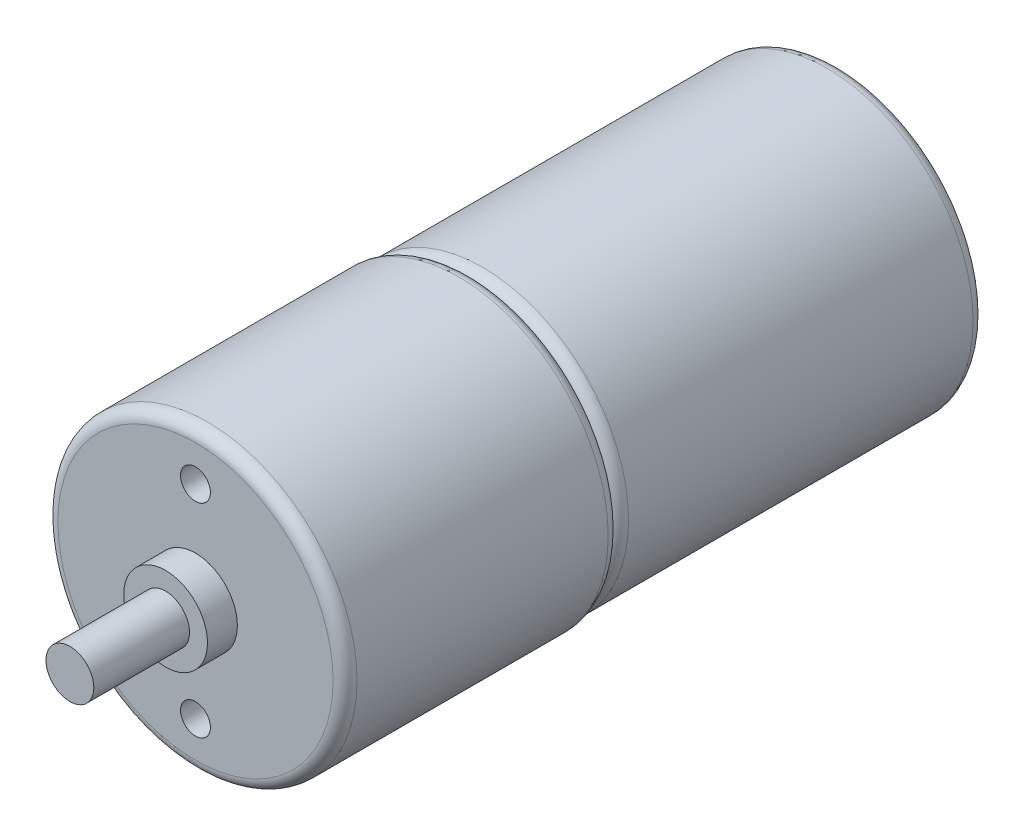
ISO-10303-21;
HEADER;
FILE_DESCRIPTION(('STEP AP214'),'2;1');
FILE_NAME('part.step','',(''),(''),'','','');
FILE_SCHEMA(('AUTOMOTIVE_DESIGN { 1 0 10303 214 1 1 1 1 }'));
ENDSEC;
DATA;
#1=APPLICATION_CONTEXT('core data for automotive mechanical design processes');
#2=APPLICATION_PROTOCOL_DEFINITION('international standard','automotive_design',2000,#1);
#3=PRODUCT_CONTEXT('',#1,'mechanical');
#4=PRODUCT('Part','Part','',(#3));
#5=PRODUCT_RELATED_PRODUCT_CATEGORY('part','',(#4));
#6=PRODUCT_DEFINITION_FORMATION('','',#4);
#7=PRODUCT_DEFINITION_CONTEXT('part definition',#1,'design');
#8=PRODUCT_DEFINITION('design','',#6,#7);
#9=PRODUCT_DEFINITION_SHAPE('','',#8);
#10=(LENGTH_UNIT() NAMED_UNIT(*) SI_UNIT(.MILLI.,.METRE.));
#11=(NAMED_UNIT(*) PLANE_ANGLE_UNIT() SI_UNIT($,.RADIAN.));
#12=(NAMED_UNIT(*) SI_UNIT($,.STERADIAN.) SOLID_ANGLE_UNIT());
#13=UNCERTAINTY_MEASURE_WITH_UNIT(LENGTH_MEASURE(1.E-05),#10,'distance_accuracy_value','');
#14=(GEOMETRIC_REPRESENTATION_CONTEXT(3) GLOBAL_UNCERTAINTY_ASSIGNED_CONTEXT((#13)) GLOBAL_UNIT_ASSIGNED_CONTEXT((#10,
#11,#12)) REPRESENTATION_CONTEXT('',''));
#15=CARTESIAN_POINT('',(0.,0.,0.));
#16=DIRECTION('',(0.,0.,1.));
#17=DIRECTION('',(1.,0.,0.));
#18=AXIS2_PLACEMENT_3D('',#15,#16,#17);
#19=CARTESIAN_POINT('',(-6.47143601205193,0.742894440159164,56.2999999999951));
#20=DIRECTION('',(0.,0.,1.));
#21=DIRECTION('',(1.,0.,0.));
#22=AXIS2_PLACEMENT_3D('',#19,#20,#21);
#23=PLANE('',#22);
#24=CARTESIAN_POINT('',(-6.47143601205193,0.742894440159164,56.2999999999951));
#25=DIRECTION('',(0.,0.,1.));
#26=DIRECTION('',(1.,0.,0.));
#27=AXIS2_PLACEMENT_3D('',#24,#25,#26);
#28=CIRCLE('',#27,3.5);
#29=CARTESIAN_POINT('',(-2.97143601205193,0.742894440159164,56.2999999999951));
#30=VERTEX_POINT('',#29);
#31=EDGE_CURVE('P0_E34',#30,#30,#28,.T.);
#32=ORIENTED_EDGE('',*,*,#31,.T.);
#33=EDGE_LOOP('',(#32));
#34=FACE_BOUND('',#33,.T.);
#35=CARTESIAN_POINT('',(-6.47143601205193,0.742894440159164,56.2999999999951));
#36=DIRECTION('',(0.,0.,1.));
#37=DIRECTION('',(1.,0.,0.));
#38=AXIS2_PLACEMENT_3D('',#35,#36,#37);
#39=CIRCLE('',#38,2.);
#40=CARTESIAN_POINT('',(-4.47143601205193,0.742894440159164,56.2999999999951));
#41=VERTEX_POINT('',#40);
#42=EDGE_CURVE('P0_E41',#41,#41,#39,.T.);
#43=ORIENTED_EDGE('',*,*,#42,.F.);
#44=EDGE_LOOP('',(#43));
#45=FACE_BOUND('',#44,.T.);
#46=ADVANCED_FACE('P0_F14',(#34,#45),#23,.T.);
#47=CARTESIAN_POINT('',(-6.47143601205193,0.742894440159164,53.7999999999951));
#48=DIRECTION('',(0.,0.,1.));
#49=DIRECTION('',(1.,0.,0.));
#50=AXIS2_PLACEMENT_3D('',#47,#48,#49);
#51=PLANE('',#50);
#52=CARTESIAN_POINT('',(-6.47143601205229,-7.75710555984084,53.7999999999951));
#53=DIRECTION('',(0.,0.,1.));
#54=DIRECTION('',(1.,0.,0.));
#55=AXIS2_PLACEMENT_3D('',#52,#53,#54);
#56=CIRCLE('',#55,1.25);
#57=CARTESIAN_POINT('',(-5.22143601205229,-7.75710555984084,53.7999999999951));
#58=VERTEX_POINT('',#57);
#59=EDGE_CURVE('P0_E53',#58,#58,#56,.T.);
#60=ORIENTED_EDGE('',*,*,#59,.F.);
#61=EDGE_LOOP('',(#60));
#62=FACE_BOUND('',#61,.T.);
#63=CARTESIAN_POINT('',(-6.47143601205223,9.24289444015916,53.7999999999951));
#64=DIRECTION('',(0.,0.,1.));
#65=DIRECTION('',(1.,0.,0.));
#66=AXIS2_PLACEMENT_3D('',#63,#64,#65);
#67=CIRCLE('',#66,1.25);
#68=CARTESIAN_POINT('',(-5.22143601205223,9.24289444015916,53.7999999999951));
#69=VERTEX_POINT('',#68);
#70=EDGE_CURVE('P0_E47',#69,#69,#67,.T.);
#71=ORIENTED_EDGE('',*,*,#70,.F.);
#72=EDGE_LOOP('',(#71));
#73=FACE_BOUND('',#72,.T.);
#74=CARTESIAN_POINT('',(-6.47143601205193,0.742894440159164,53.7999999999951));
#75=DIRECTION('',(0.,0.,1.));
#76=DIRECTION('',(1.,0.,0.));
#77=AXIS2_PLACEMENT_3D('',#74,#75,#76);
#78=CIRCLE('',#77,11.5);
#79=CARTESIAN_POINT('',(5.02856398794807,0.742894440159164,53.7999999999951));
#80=VERTEX_POINT('',#79);
#81=EDGE_CURVE('P0_E10',#80,#80,#78,.T.);
#82=ORIENTED_EDGE('',*,*,#81,.T.);
#83=EDGE_LOOP('',(#82));
#84=FACE_BOUND('',#83,.T.);
#85=CARTESIAN_POINT('',(-6.47143601205193,0.742894440159164,53.7999999999951));
#86=DIRECTION('',(0.,0.,1.));
#87=DIRECTION('',(1.,0.,0.));
#88=AXIS2_PLACEMENT_3D('',#85,#86,#87);
#89=CIRCLE('',#88,3.5);
#90=CARTESIAN_POINT('',(-2.97143601205193,0.742894440159164,53.7999999999951));
#91=VERTEX_POINT('',#90);
#92=EDGE_CURVE('P0_E35',#91,#91,#89,.T.);
#93=ORIENTED_EDGE('',*,*,#92,.F.);
#94=EDGE_LOOP('',(#93));
#95=FACE_BOUND('',#94,.T.);
#96=ADVANCED_FACE('P0_F68',(#62,#73,#84,#95),#51,.T.);
#97=CARTESIAN_POINT('',(-6.47143601205193,0.742894440159164,53.7999999999951));
#98=DIRECTION('',(0.,0.,-1.));
#99=DIRECTION('',(-1.,0.,0.));
#100=AXIS2_PLACEMENT_3D('',#97,#98,#99);
#101=CYLINDRICAL_SURFACE('',#100,12.5);
#102=CARTESIAN_POINT('',(-6.47143601205193,0.742894440159164,31.7999999999951));
#103=DIRECTION('',(0.,0.,1.));
#104=DIRECTION('',(1.,0.,0.));
#105=AXIS2_PLACEMENT_3D('',#102,#103,#104);
#106=CIRCLE('',#105,12.5);
#107=CARTESIAN_POINT('',(6.02856398794807,0.742894440159164,31.7999999999951));
#108=VERTEX_POINT('',#107);
#109=EDGE_CURVE('P0_E25',#108,#108,#106,.T.);
#110=ORIENTED_EDGE('',*,*,#109,.T.);
#111=EDGE_LOOP('',(#110));
#112=FACE_BOUND('',#111,.T.);
#113=CARTESIAN_POINT('',(-6.47143601205193,0.742894440159164,52.7999999999951));
#114=DIRECTION('',(0.,0.,1.));
#115=DIRECTION('',(1.,0.,0.));
#116=AXIS2_PLACEMENT_3D('',#113,#114,#115);
#117=CIRCLE('',#116,12.5);
#118=CARTESIAN_POINT('',(6.02856398794807,0.742894440159164,52.7999999999951));
#119=VERTEX_POINT('',#118);
#120=EDGE_CURVE('P0_E29',#119,#119,#117,.F.);
#121=ORIENTED_EDGE('',*,*,#120,.T.);
#122=EDGE_LOOP('',(#121));
#123=FACE_BOUND('',#122,.T.);
#124=ADVANCED_FACE('P0_F71',(#112,#123),#101,.T.);
#125=CARTESIAN_POINT('',(-6.47143601205193,0.742894440159164,30.7999999999951));
#126=DIRECTION('',(0.,0.,1.));
#127=DIRECTION('',(1.,0.,0.));
#128=AXIS2_PLACEMENT_3D('',#125,#126,#127);
#129=PLANE('',#128);
#130=CARTESIAN_POINT('',(-6.47143601205193,0.742894440159164,30.7999999999951));
#131=DIRECTION('',(0.,0.,1.));
#132=DIRECTION('',(1.,0.,0.));
#133=AXIS2_PLACEMENT_3D('',#130,#131,#132);
#134=CIRCLE('',#133,11.5);
#135=CARTESIAN_POINT('',(5.02856398794807,0.742894440159164,30.7999999999951));
#136=VERTEX_POINT('',#135);
#137=EDGE_CURVE('P0_E21',#136,#136,#134,.F.);
#138=ORIENTED_EDGE('',*,*,#137,.T.);
#139=EDGE_LOOP('',(#138));
#140=FACE_BOUND('',#139,.T.);
#141=ADVANCED_FACE('P0_F80',(#140),#129,.F.);
#142=CARTESIAN_POINT('',(-6.47143601205193,0.742894440159164,56.2999999999951));
#143=DIRECTION('',(0.,0.,-1.));
#144=DIRECTION('',(-1.,0.,0.));
#145=AXIS2_PLACEMENT_3D('',#142,#143,#144);
#146=CYLINDRICAL_SURFACE('',#145,3.5);
#147=ORIENTED_EDGE('',*,*,#31,.F.);
#148=EDGE_LOOP('',(#147));
#149=FACE_BOUND('',#148,.T.);
#150=ORIENTED_EDGE('',*,*,#92,.T.);
#151=EDGE_LOOP('',(#150));
#152=FACE_BOUND('',#151,.T.);
#153=ADVANCED_FACE('P0_F77',(#149,#152),#146,.T.);
#154=CARTESIAN_POINT('',(-6.47143601205193,0.742894440159164,31.7999999999951));
#155=DIRECTION('',(0.,0.,1.));
#156=DIRECTION('',(1.,0.,0.));
#157=AXIS2_PLACEMENT_3D('',#154,#155,#156);
#158=TOROIDAL_SURFACE('',#157,11.5,1.);
#159=ORIENTED_EDGE('',*,*,#137,.F.);
#160=EDGE_LOOP('',(#159));
#161=FACE_BOUND('',#160,.T.);
#162=ORIENTED_EDGE('',*,*,#109,.F.);
#163=EDGE_LOOP('',(#162));
#164=FACE_BOUND('',#163,.T.);
#165=ADVANCED_FACE('P0_F79',(#161,#164),#158,.T.);
#166=CARTESIAN_POINT('',(-6.47143601205193,0.742894440159164,52.7999999999951));
#167=DIRECTION('',(0.,0.,1.));
#168=DIRECTION('',(1.,0.,0.));
#169=AXIS2_PLACEMENT_3D('',#166,#167,#168);
#170=TOROIDAL_SURFACE('',#169,11.5,1.);
#171=ORIENTED_EDGE('',*,*,#120,.F.);
#172=EDGE_LOOP('',(#171));
#173=FACE_BOUND('',#172,.T.);
#174=ORIENTED_EDGE('',*,*,#81,.F.);
#175=EDGE_LOOP('',(#174));
#176=FACE_BOUND('',#175,.T.);
#177=ADVANCED_FACE('P0_F16',(#173,#176),#170,.T.);
#178=CARTESIAN_POINT('',(-6.47143601205193,0.742894440159164,64.2999999999951));
#179=DIRECTION('',(0.,0.,-1.));
#180=DIRECTION('',(-1.,0.,0.));
#181=AXIS2_PLACEMENT_3D('',#178,#179,#180);
#182=CYLINDRICAL_SURFACE('',#181,2.);
#183=CARTESIAN_POINT('',(-6.47143601205193,0.742894440159164,64.2999999999951));
#184=DIRECTION('',(0.,0.,1.));
#185=DIRECTION('',(1.,0.,0.));
#186=AXIS2_PLACEMENT_3D('',#183,#184,#185);
#187=CIRCLE('',#186,2.);
#188=CARTESIAN_POINT('',(-4.47143601205193,0.742894440159164,64.2999999999951));
#189=VERTEX_POINT('',#188);
#190=EDGE_CURVE('P0_E38',#189,#189,#187,.T.);
#191=ORIENTED_EDGE('',*,*,#190,.F.);
#192=EDGE_LOOP('',(#191));
#193=FACE_BOUND('',#192,.T.);
#194=ORIENTED_EDGE('',*,*,#42,.T.);
#195=EDGE_LOOP('',(#194));
#196=FACE_BOUND('',#195,.T.);
#197=ADVANCED_FACE('P0_F98',(#193,#196),#182,.T.);
#198=CARTESIAN_POINT('',(-6.47143601205193,0.742894440159164,64.2999999999951));
#199=DIRECTION('',(0.,0.,1.));
#200=DIRECTION('',(1.,0.,0.));
#201=AXIS2_PLACEMENT_3D('',#198,#199,#200);
#202=PLANE('',#201);
#203=ORIENTED_EDGE('',*,*,#190,.T.);
#204=EDGE_LOOP('',(#203));
#205=FACE_BOUND('',#204,.T.);
#206=ADVANCED_FACE('P0_F101',(#205),#202,.T.);
#207=CARTESIAN_POINT('',(-6.47143601205223,9.24289444015916,43.7999999999951));
#208=DIRECTION('',(0.,0.,1.));
#209=DIRECTION('',(1.,0.,0.));
#210=AXIS2_PLACEMENT_3D('',#207,#208,#209);
#211=CYLINDRICAL_SURFACE('',#210,1.25);
#212=CARTESIAN_POINT('',(-6.47143601205223,9.24289444015916,43.7999999999951));
#213=DIRECTION('',(0.,0.,1.));
#214=DIRECTION('',(1.,0.,0.));
#215=AXIS2_PLACEMENT_3D('',#212,#213,#214);
#216=CIRCLE('',#215,1.25);
#217=CARTESIAN_POINT('',(-5.22143601205223,9.24289444015916,43.7999999999951));
#218=VERTEX_POINT('',#217);
#219=EDGE_CURVE('P0_E44',#218,#218,#216,.T.);
#220=ORIENTED_EDGE('',*,*,#219,.F.);
#221=EDGE_LOOP('',(#220));
#222=FACE_BOUND('',#221,.T.);
#223=ORIENTED_EDGE('',*,*,#70,.T.);
#224=EDGE_LOOP('',(#223));
#225=FACE_BOUND('',#224,.T.);
#226=ADVANCED_FACE('P0_F105',(#222,#225),#211,.F.);
#227=CARTESIAN_POINT('',(-6.47143601205223,9.24289444015916,43.7999999999951));
#228=DIRECTION('',(0.,0.,1.));
#229=DIRECTION('',(1.,0.,0.));
#230=AXIS2_PLACEMENT_3D('',#227,#228,#229);
#231=PLANE('',#230);
#232=ORIENTED_EDGE('',*,*,#219,.T.);
#233=EDGE_LOOP('',(#232));
#234=FACE_BOUND('',#233,.T.);
#235=ADVANCED_FACE('P0_F64',(#234),#231,.T.);
#236=CARTESIAN_POINT('',(-6.47143601205229,-7.75710555984084,43.7999999999951));
#237=DIRECTION('',(0.,0.,1.));
#238=DIRECTION('',(1.,0.,0.));
#239=AXIS2_PLACEMENT_3D('',#236,#237,#238);
#240=CYLINDRICAL_SURFACE('',#239,1.25);
#241=CARTESIAN_POINT('',(-6.47143601205229,-7.75710555984084,43.7999999999951));
#242=DIRECTION('',(0.,0.,1.));
#243=DIRECTION('',(1.,0.,0.));
#244=AXIS2_PLACEMENT_3D('',#241,#242,#243);
#245=CIRCLE('',#244,1.25);
#246=CARTESIAN_POINT('',(-5.22143601205229,-7.75710555984084,43.7999999999951));
#247=VERTEX_POINT('',#246);
#248=EDGE_CURVE('P0_E50',#247,#247,#245,.T.);
#249=ORIENTED_EDGE('',*,*,#248,.F.);
#250=EDGE_LOOP('',(#249));
#251=FACE_BOUND('',#250,.T.);
#252=ORIENTED_EDGE('',*,*,#59,.T.);
#253=EDGE_LOOP('',(#252));
#254=FACE_BOUND('',#253,.T.);
#255=ADVANCED_FACE('P0_F61',(#251,#254),#240,.F.);
#256=CARTESIAN_POINT('',(-6.47143601205229,-7.75710555984084,43.7999999999951));
#257=DIRECTION('',(0.,0.,1.));
#258=DIRECTION('',(1.,0.,0.));
#259=AXIS2_PLACEMENT_3D('',#256,#257,#258);
#260=PLANE('',#259);
#261=ORIENTED_EDGE('',*,*,#248,.T.);
#262=EDGE_LOOP('',(#261));
#263=FACE_BOUND('',#262,.T.);
#264=ADVANCED_FACE('P0_F59',(#263),#260,.T.);
#265=CLOSED_SHELL('',(#46,#96,#124,#141,#153,#165,#177,#197,#206,#226,#235,#255,#264));
#266=MANIFOLD_SOLID_BREP('P0_B1',#265);
#267=CARTESIAN_POINT('',(-6.47143601205193,0.742894440159164,30.7999999999951));
#268=DIRECTION('',(0.,0.,1.));
#269=DIRECTION('',(1.,0.,0.));
#270=AXIS2_PLACEMENT_3D('',#267,#268,#269);
#271=PLANE('',#270);
#272=CARTESIAN_POINT('',(-6.47143601205193,0.742894440159164,30.7999999999951));
#273=DIRECTION('',(0.,0.,1.));
#274=DIRECTION('',(1.,0.,0.));
#275=AXIS2_PLACEMENT_3D('',#272,#273,#274);
#276=CIRCLE('',#275,11.2);
#277=CARTESIAN_POINT('',(4.72856398794807,0.742894440159164,30.7999999999951));
#278=VERTEX_POINT('',#277);
#279=EDGE_CURVE('P1_E10',#278,#278,#276,.T.);
#280=ORIENTED_EDGE('',*,*,#279,.T.);
#281=EDGE_LOOP('',(#280));
#282=FACE_BOUND('',#281,.T.);
#283=CARTESIAN_POINT('',(-6.47143601205193,0.742894440159164,30.7999999999951));
#284=DIRECTION('',(0.,0.,1.));
#285=DIRECTION('',(1.,0.,0.));
#286=AXIS2_PLACEMENT_3D('',#283,#284,#285);
#287=CIRCLE('',#286,2.);
#288=CARTESIAN_POINT('',(-4.47143601205193,0.742894440159164,30.7999999999951));
#289=VERTEX_POINT('',#288);
#290=EDGE_CURVE('P1_E36',#289,#289,#287,.T.);
#291=ORIENTED_EDGE('',*,*,#290,.F.);
#292=EDGE_LOOP('',(#291));
#293=FACE_BOUND('',#292,.T.);
#294=ADVANCED_FACE('P1_F15',(#282,#293),#271,.T.);
#295=CARTESIAN_POINT('',(-6.47143601205193,0.742894440159164,30.7999999999951));
#296=DIRECTION('',(0.,0.,-1.));
#297=DIRECTION('',(-1.,0.,0.));
#298=AXIS2_PLACEMENT_3D('',#295,#296,#297);
#299=CYLINDRICAL_SURFACE('',#298,12.2);
#300=CARTESIAN_POINT('',(-6.47143601205193,0.742894440159164,0.999999999995088));
#301=DIRECTION('',(0.,0.,1.));
#302=DIRECTION('',(1.,0.,0.));
#303=AXIS2_PLACEMENT_3D('',#300,#301,#302);
#304=CIRCLE('',#303,12.2);
#305=CARTESIAN_POINT('',(-18.6714360120519,0.742894440159164,0.999999999995085));
#306=VERTEX_POINT('',#305);
#307=EDGE_CURVE('P1_E26',#306,#306,#304,.T.);
#308=CARTESIAN_POINT('',(-6.47143601205193,0.742894440159164,29.7999999999951));
#309=DIRECTION('',(0.,0.,1.));
#310=DIRECTION('',(1.,0.,0.));
#311=AXIS2_PLACEMENT_3D('',#308,#309,#310);
#312=CIRCLE('',#311,12.2);
#313=CARTESIAN_POINT('',(-18.6714360120519,0.742894440159164,29.7999999999951));
#314=VERTEX_POINT('',#313);
#315=EDGE_CURVE('P1_E30',#314,#314,#312,.F.);
#316=CARTESIAN_POINT('',(-18.6714360120519,0.742894440159164,0.999999999995085));
#317=CARTESIAN_POINT('',(-18.6714360120519,0.742894440159164,1.29999999999508));
#318=CARTESIAN_POINT('',(-18.6714360120519,0.742894440159164,1.59999999999509));
#319=CARTESIAN_POINT('',(-18.6714360120519,0.742894440159164,2.19999999999509));
#320=CARTESIAN_POINT('',(-18.6714360120519,0.742894440159164,2.49999999999509));
#321=CARTESIAN_POINT('',(-18.6714360120519,0.742894440159164,3.09999999999508));
#322=CARTESIAN_POINT('',(-18.6714360120519,0.742894440159164,3.39999999999509));
#323=CARTESIAN_POINT('',(-18.6714360120519,0.742894440159164,3.99999999999508));
#324=CARTESIAN_POINT('',(-18.6714360120519,0.742894440159164,4.29999999999508));
#325=CARTESIAN_POINT('',(-18.6714360120519,0.742894440159164,4.89999999999508));
#326=CARTESIAN_POINT('',(-18.6714360120519,0.742894440159164,5.19999999999508));
#327=CARTESIAN_POINT('',(-18.6714360120519,0.742894440159164,5.79999999999509));
#328=CARTESIAN_POINT('',(-18.6714360120519,0.742894440159164,6.09999999999509));
#329=CARTESIAN_POINT('',(-18.6714360120519,0.742894440159164,6.69999999999509));
#330=CARTESIAN_POINT('',(-18.6714360120519,0.742894440159164,6.99999999999509));
#331=CARTESIAN_POINT('',(-18.6714360120519,0.742894440159164,7.59999999999509));
#332=CARTESIAN_POINT('',(-18.6714360120519,0.742894440159164,7.89999999999509));
#333=CARTESIAN_POINT('',(-18.6714360120519,0.742894440159164,8.49999999999509));
#334=CARTESIAN_POINT('',(-18.6714360120519,0.742894440159164,8.79999999999509));
#335=CARTESIAN_POINT('',(-18.6714360120519,0.742894440159164,9.39999999999509));
#336=CARTESIAN_POINT('',(-18.6714360120519,0.742894440159164,9.69999999999509));
#337=CARTESIAN_POINT('',(-18.6714360120519,0.742894440159164,10.2999999999951));
#338=CARTESIAN_POINT('',(-18.6714360120519,0.742894440159164,10.5999999999951));
#339=CARTESIAN_POINT('',(-18.6714360120519,0.742894440159164,11.1999999999951));
#340=CARTESIAN_POINT('',(-18.6714360120519,0.742894440159164,11.4999999999951));
#341=CARTESIAN_POINT('',(-18.6714360120519,0.742894440159164,12.0999999999951));
#342=CARTESIAN_POINT('',(-18.6714360120519,0.742894440159164,12.3999999999951));
#343=CARTESIAN_POINT('',(-18.6714360120519,0.742894440159164,12.9999999999951));
#344=CARTESIAN_POINT('',(-18.6714360120519,0.742894440159164,13.2999999999951));
#345=CARTESIAN_POINT('',(-18.6714360120519,0.742894440159164,13.8999999999951));
#346=CARTESIAN_POINT('',(-18.6714360120519,0.742894440159164,14.1999999999951));
#347=CARTESIAN_POINT('',(-18.6714360120519,0.742894440159164,14.7999999999951));
#348=CARTESIAN_POINT('',(-18.6714360120519,0.742894440159164,15.0999999999951));
#349=CARTESIAN_POINT('',(-18.6714360120519,0.742894440159164,15.6999999999951));
#350=CARTESIAN_POINT('',(-18.6714360120519,0.742894440159164,15.9999999999951));
#351=CARTESIAN_POINT('',(-18.6714360120519,0.742894440159164,16.5999999999951));
#352=CARTESIAN_POINT('',(-18.6714360120519,0.742894440159164,16.8999999999951));
#353=CARTESIAN_POINT('',(-18.6714360120519,0.742894440159164,17.4999999999951));
#354=CARTESIAN_POINT('',(-18.6714360120519,0.742894440159164,17.7999999999951));
#355=CARTESIAN_POINT('',(-18.6714360120519,0.742894440159164,18.3999999999951));
#356=CARTESIAN_POINT('',(-18.6714360120519,0.742894440159164,18.6999999999951));
#357=CARTESIAN_POINT('',(-18.6714360120519,0.742894440159164,19.2999999999951));
#358=CARTESIAN_POINT('',(-18.6714360120519,0.742894440159164,19.5999999999951));
#359=CARTESIAN_POINT('',(-18.6714360120519,0.742894440159164,20.1999999999951));
#360=CARTESIAN_POINT('',(-18.6714360120519,0.742894440159164,20.4999999999951));
#361=CARTESIAN_POINT('',(-18.6714360120519,0.742894440159164,21.0999999999951));
#362=CARTESIAN_POINT('',(-18.6714360120519,0.742894440159164,21.3999999999951));
#363=CARTESIAN_POINT('',(-18.6714360120519,0.742894440159164,21.9999999999951));
#364=CARTESIAN_POINT('',(-18.6714360120519,0.742894440159164,22.2999999999951));
#365=CARTESIAN_POINT('',(-18.6714360120519,0.742894440159164,22.8999999999951));
#366=CARTESIAN_POINT('',(-18.6714360120519,0.742894440159164,23.1999999999951));
#367=CARTESIAN_POINT('',(-18.6714360120519,0.742894440159164,23.7999999999951));
#368=CARTESIAN_POINT('',(-18.6714360120519,0.742894440159164,24.0999999999951));
#369=CARTESIAN_POINT('',(-18.6714360120519,0.742894440159164,24.6999999999951));
#370=CARTESIAN_POINT('',(-18.6714360120519,0.742894440159164,24.9999999999951));
#371=CARTESIAN_POINT('',(-18.6714360120519,0.742894440159164,25.5999999999951));
#372=CARTESIAN_POINT('',(-18.6714360120519,0.742894440159164,25.8999999999951));
#373=CARTESIAN_POINT('',(-18.6714360120519,0.742894440159164,26.4999999999951));
#374=CARTESIAN_POINT('',(-18.6714360120519,0.742894440159164,26.7999999999951));
#375=CARTESIAN_POINT('',(-18.6714360120519,0.742894440159164,27.3999999999951));
#376=CARTESIAN_POINT('',(-18.6714360120519,0.742894440159164,27.6999999999951));
#377=CARTESIAN_POINT('',(-18.6714360120519,0.742894440159164,28.2999999999951));
#378=CARTESIAN_POINT('',(-18.6714360120519,0.742894440159164,28.5999999999951));
#379=CARTESIAN_POINT('',(-18.6714360120519,0.742894440159164,29.1999999999951));
#380=CARTESIAN_POINT('',(-18.6714360120519,0.742894440159164,29.4999999999951));
#381=CARTESIAN_POINT('',(-18.6714360120519,0.742894440159164,29.7999999999951));
#382=B_SPLINE_CURVE_WITH_KNOTS('',3,(#316,#317,#318,#319,#320,#321,#322,#323,#324,#325,#326,
#327,#328,#329,#330,#331,#332,#333,#334,#335,#336,#337,#338,#339,#340,#341,#342,#343,#344,#345,
#346,#347,#348,#349,#350,#351,#352,#353,#354,#355,#356,#357,#358,#359,#360,#361,#362,#363,#364,
#365,#366,#367,#368,#369,#370,#371,#372,#373,#374,#375,#376,#377,#378,#379,#380,#381),
.UNSPECIFIED.,.F.,.F.,(4,2,2,2,2,2,2,2,2,2,2,2,2,2,2,2,2,2,2,2,2,2,2,2,2,2,2,2,2,2,2,2,4),(0.,
0.900000000000001,1.8,2.7,3.6,4.5,5.4,6.3,7.2,8.1,9.,9.9,10.8,11.7,12.6,13.5,14.4,15.3,16.2,
17.1,18.,18.9,19.8,20.7,21.6,22.5,23.4,24.3,25.2,26.1,27.,27.9,28.8),.UNSPECIFIED.);
#383=EDGE_CURVE('P1_BSEAM51',#306,#314,#382,.T.);
#384=ORIENTED_EDGE('',*,*,#307,.T.);
#385=ORIENTED_EDGE('',*,*,#315,.T.);
#386=ORIENTED_EDGE('',*,*,#383,.T.);
#387=ORIENTED_EDGE('',*,*,#383,.F.);
#388=EDGE_LOOP('',(#384,#386,#385,#387));
#389=FACE_BOUND('',#388,.T.);
#390=ADVANCED_FACE('P1_F51',(#389),#299,.T.);
#391=CARTESIAN_POINT('',(-6.47143601205193,0.742894440159164,-4.91273688396632E-12));
#392=DIRECTION('',(0.,0.,1.));
#393=DIRECTION('',(1.,0.,0.));
#394=AXIS2_PLACEMENT_3D('',#391,#392,#393);
#395=PLANE('',#394);
#396=CARTESIAN_POINT('',(-6.47143601205193,0.742894440159164,-4.91273688396632E-12));
#397=DIRECTION('',(0.,0.,1.));
#398=DIRECTION('',(1.,0.,0.));
#399=AXIS2_PLACEMENT_3D('',#396,#397,#398);
#400=CIRCLE('',#399,11.2);
#401=CARTESIAN_POINT('',(4.72856398794807,0.742894440159164,-4.91273688396632E-12));
#402=VERTEX_POINT('',#401);
#403=EDGE_CURVE('P1_E22',#402,#402,#400,.F.);
#404=ORIENTED_EDGE('',*,*,#403,.T.);
#405=EDGE_LOOP('',(#404));
#406=FACE_BOUND('',#405,.T.);
#407=ADVANCED_FACE('P1_F57',(#406),#395,.F.);
#408=CARTESIAN_POINT('',(-6.47143601205193,0.742894440159164,0.999999999995088));
#409=DIRECTION('',(0.,0.,1.));
#410=DIRECTION('',(1.,0.,0.));
#411=AXIS2_PLACEMENT_3D('',#408,#409,#410);
#412=TOROIDAL_SURFACE('',#411,11.2,1.);
#413=ORIENTED_EDGE('',*,*,#403,.F.);
#414=EDGE_LOOP('',(#413));
#415=FACE_BOUND('',#414,.T.);
#416=ORIENTED_EDGE('',*,*,#307,.F.);
#417=EDGE_LOOP('',(#416));
#418=FACE_BOUND('',#417,.T.);
#419=ADVANCED_FACE('P1_F63',(#415,#418),#412,.T.);
#420=CARTESIAN_POINT('',(-6.47143601205193,0.742894440159164,29.7999999999951));
#421=DIRECTION('',(0.,0.,1.));
#422=DIRECTION('',(1.,0.,0.));
#423=AXIS2_PLACEMENT_3D('',#420,#421,#422);
#424=TOROIDAL_SURFACE('',#423,11.2,1.);
#425=ORIENTED_EDGE('',*,*,#315,.F.);
#426=EDGE_LOOP('',(#425));
#427=FACE_BOUND('',#426,.T.);
#428=ORIENTED_EDGE('',*,*,#279,.F.);
#429=EDGE_LOOP('',(#428));
#430=FACE_BOUND('',#429,.T.);
#431=ADVANCED_FACE('P1_F17',(#427,#430),#424,.T.);
#432=CARTESIAN_POINT('',(-6.47143601205193,0.742894440159164,40.7999999999951));
#433=DIRECTION('',(0.,0.,-1.));
#434=DIRECTION('',(-1.,0.,0.));
#435=AXIS2_PLACEMENT_3D('',#432,#433,#434);
#436=CYLINDRICAL_SURFACE('',#435,2.);
#437=CARTESIAN_POINT('',(-6.47143601205193,0.742894440159164,40.7999999999951));
#438=DIRECTION('',(0.,0.,1.));
#439=DIRECTION('',(1.,0.,0.));
#440=AXIS2_PLACEMENT_3D('',#437,#438,#439);
#441=CIRCLE('',#440,2.);
#442=CARTESIAN_POINT('',(-4.47143601205193,0.742894440159164,40.7999999999951));
#443=VERTEX_POINT('',#442);
#444=EDGE_CURVE('P1_E35',#443,#443,#441,.T.);
#445=ORIENTED_EDGE('',*,*,#444,.F.);
#446=EDGE_LOOP('',(#445));
#447=FACE_BOUND('',#446,.T.);
#448=ORIENTED_EDGE('',*,*,#290,.T.);
#449=EDGE_LOOP('',(#448));
#450=FACE_BOUND('',#449,.T.);
#451=ADVANCED_FACE('P1_F44',(#447,#450),#436,.T.);
#452=CARTESIAN_POINT('',(-6.47143601205193,0.742894440159164,40.7999999999951));
#453=DIRECTION('',(0.,0.,1.));
#454=DIRECTION('',(1.,0.,0.));
#455=AXIS2_PLACEMENT_3D('',#452,#453,#454);
#456=PLANE('',#455);
#457=ORIENTED_EDGE('',*,*,#444,.T.);
#458=EDGE_LOOP('',(#457));
#459=FACE_BOUND('',#458,.T.);
#460=ADVANCED_FACE('P1_F42',(#459),#456,.T.);
#461=CLOSED_SHELL('',(#294,#390,#407,#419,#431,#451,#460));
#462=MANIFOLD_SOLID_BREP('P1_B1',#461);
#463=ADVANCED_BREP_SHAPE_REPRESENTATION('',(#18,#266,#462),#14);
#464=SHAPE_DEFINITION_REPRESENTATION(#9,#463);
ENDSEC;
END-ISO-10303-21;
